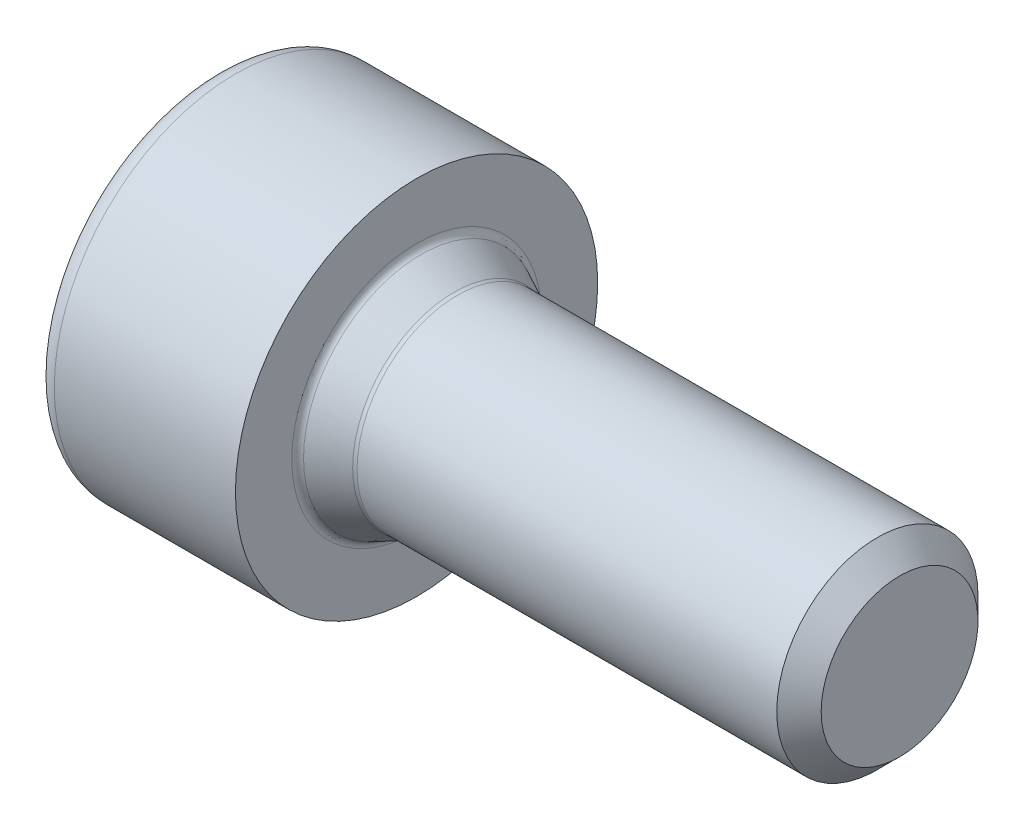
ISO-10303-21;
HEADER;
FILE_DESCRIPTION(('STEP AP214'),'2;1');
FILE_NAME('part.step','',(''),(''),'','','');
FILE_SCHEMA(('AUTOMOTIVE_DESIGN { 1 0 10303 214 1 1 1 1 }'));
ENDSEC;
DATA;
#1=APPLICATION_CONTEXT('core data for automotive mechanical design processes');
#2=APPLICATION_PROTOCOL_DEFINITION('international standard','automotive_design',2000,#1);
#3=PRODUCT_CONTEXT('',#1,'mechanical');
#4=PRODUCT('Part','Part','',(#3));
#5=PRODUCT_RELATED_PRODUCT_CATEGORY('part','',(#4));
#6=PRODUCT_DEFINITION_FORMATION('','',#4);
#7=PRODUCT_DEFINITION_CONTEXT('part definition',#1,'design');
#8=PRODUCT_DEFINITION('design','',#6,#7);
#9=PRODUCT_DEFINITION_SHAPE('','',#8);
#10=(LENGTH_UNIT() NAMED_UNIT(*) SI_UNIT(.MILLI.,.METRE.));
#11=(NAMED_UNIT(*) PLANE_ANGLE_UNIT() SI_UNIT($,.RADIAN.));
#12=(NAMED_UNIT(*) SI_UNIT($,.STERADIAN.) SOLID_ANGLE_UNIT());
#13=UNCERTAINTY_MEASURE_WITH_UNIT(LENGTH_MEASURE(1.E-05),#10,'distance_accuracy_value','');
#14=(GEOMETRIC_REPRESENTATION_CONTEXT(3) GLOBAL_UNCERTAINTY_ASSIGNED_CONTEXT((#13)) GLOBAL_UNIT_ASSIGNED_CONTEXT((#10,
#11,#12)) REPRESENTATION_CONTEXT('',''));
#15=CARTESIAN_POINT('',(0.,0.,0.));
#16=DIRECTION('',(0.,0.,1.));
#17=DIRECTION('',(1.,0.,0.));
#18=AXIS2_PLACEMENT_3D('',#15,#16,#17);
#19=CARTESIAN_POINT('',(-0.850000002960261,0.,0.));
#20=DIRECTION('',(-1.,0.,0.));
#21=DIRECTION('',(0.,0.,1.));
#22=AXIS2_PLACEMENT_3D('',#19,#20,#21);
#23=CONICAL_SURFACE('',#22,0.999999998290924,1.04719755119989);
#24=CARTESIAN_POINT('',(-0.272649734761821,0.,-1.11022302462516E-13));
#25=VERTEX_POINT('',#24);
#26=VERTEX_LOOP('',#25);
#27=FACE_BOUND('',#26,.T.);
#28=CARTESIAN_POINT('',(-0.850000002960261,0.,0.));
#29=DIRECTION('',(-1.,0.,0.));
#30=DIRECTION('',(0.,0.,1.));
#31=AXIS2_PLACEMENT_3D('',#28,#29,#30);
#32=CIRCLE('',#31,0.999999998290924);
#33=CARTESIAN_POINT('',(-0.85000000148013,0.866025403044387,-0.499999999572731));
#34=VERTEX_POINT('',#33);
#35=CARTESIAN_POINT('',(-0.85000000148013,0.,-0.999999999145462));
#36=VERTEX_POINT('',#35);
#37=EDGE_CURVE('E19',#34,#36,#32,.T.);
#38=ORIENTED_EDGE('',*,*,#37,.T.);
#39=CARTESIAN_POINT('',(-0.850000002960261,0.,0.));
#40=DIRECTION('',(-1.,0.,0.));
#41=DIRECTION('',(0.,0.,1.));
#42=AXIS2_PLACEMENT_3D('',#39,#40,#41);
#43=CIRCLE('',#42,0.999999998290924);
#44=CARTESIAN_POINT('',(-0.85000000148013,-0.866025403044386,-0.49999999957273));
#45=VERTEX_POINT('',#44);
#46=EDGE_CURVE('E90',#36,#45,#43,.T.);
#47=ORIENTED_EDGE('',*,*,#46,.T.);
#48=CARTESIAN_POINT('',(-0.850000002960261,0.,0.));
#49=DIRECTION('',(-1.,0.,0.));
#50=DIRECTION('',(0.,0.,1.));
#51=AXIS2_PLACEMENT_3D('',#48,#49,#50);
#52=CIRCLE('',#51,0.999999998290924);
#53=CARTESIAN_POINT('',(-0.85000000148013,-0.866025403044387,0.49999999957273));
#54=VERTEX_POINT('',#53);
#55=EDGE_CURVE('E104',#45,#54,#52,.T.);
#56=ORIENTED_EDGE('',*,*,#55,.T.);
#57=CARTESIAN_POINT('',(-0.850000002960261,0.,0.));
#58=DIRECTION('',(-1.,0.,0.));
#59=DIRECTION('',(0.,0.,1.));
#60=AXIS2_PLACEMENT_3D('',#57,#58,#59);
#61=CIRCLE('',#60,0.999999998290924);
#62=CARTESIAN_POINT('',(-0.85000000148013,0.,0.999999999145462));
#63=VERTEX_POINT('',#62);
#64=EDGE_CURVE('E163',#54,#63,#61,.T.);
#65=ORIENTED_EDGE('',*,*,#64,.T.);
#66=CARTESIAN_POINT('',(-0.850000002960261,0.,0.));
#67=DIRECTION('',(-1.,0.,0.));
#68=DIRECTION('',(0.,0.,1.));
#69=AXIS2_PLACEMENT_3D('',#66,#67,#68);
#70=CIRCLE('',#69,0.999999998290924);
#71=CARTESIAN_POINT('',(-0.85000000148013,0.866025403044386,0.49999999957273));
#72=VERTEX_POINT('',#71);
#73=EDGE_CURVE('E140',#63,#72,#70,.T.);
#74=ORIENTED_EDGE('',*,*,#73,.T.);
#75=CARTESIAN_POINT('',(-0.850000002960261,0.,0.));
#76=DIRECTION('',(-1.,0.,0.));
#77=DIRECTION('',(0.,0.,1.));
#78=AXIS2_PLACEMENT_3D('',#75,#76,#77);
#79=CIRCLE('',#78,0.999999998290924);
#80=EDGE_CURVE('E87',#72,#34,#79,.T.);
#81=ORIENTED_EDGE('',*,*,#80,.T.);
#82=EDGE_LOOP('',(#38,#47,#56,#65,#74,#81));
#83=FACE_BOUND('',#82,.T.);
#84=ADVANCED_FACE('F16',(#27,#83),#23,.F.);
#85=CARTESIAN_POINT('',(-0.85,0.,0.));
#86=DIRECTION('',(1.,0.,0.));
#87=DIRECTION('',(0.,0.,-1.));
#88=AXIS2_PLACEMENT_3D('',#85,#86,#87);
#89=PLANE('',#88);
#90=DIRECTION('',(0.,1.,0.));
#91=VECTOR('',#90,1.);
#92=CARTESIAN_POINT('',(-0.85,-0.577350269189626,-1.));
#93=LINE('',#92,#91);
#94=CARTESIAN_POINT('',(-0.85,0.577350269189626,-1.));
#95=VERTEX_POINT('',#94);
#96=EDGE_CURVE('E106',#95,#36,#93,.F.);
#97=ORIENTED_EDGE('',*,*,#96,.T.);
#98=ORIENTED_EDGE('',*,*,#37,.F.);
#99=DIRECTION('',(0.,0.5,0.866025403784439));
#100=VECTOR('',#99,1.);
#101=CARTESIAN_POINT('',(-0.849999999999999,0.577350269189626,-1.));
#102=LINE('',#101,#100);
#103=EDGE_CURVE('E109',#34,#95,#102,.F.);
#104=ORIENTED_EDGE('',*,*,#103,.T.);
#105=EDGE_LOOP('',(#97,#98,#104));
#106=FACE_BOUND('',#105,.T.);
#107=ADVANCED_FACE('F107',(#106),#89,.F.);
#108=CARTESIAN_POINT('',(-0.85,0.,0.));
#109=DIRECTION('',(1.,0.,0.));
#110=DIRECTION('',(0.,0.,-1.));
#111=AXIS2_PLACEMENT_3D('',#108,#109,#110);
#112=PLANE('',#111);
#113=DIRECTION('',(0.,0.5,-0.866025403784439));
#114=VECTOR('',#113,1.);
#115=CARTESIAN_POINT('',(-0.849999999999999,-1.15470053837925,0.));
#116=LINE('',#115,#114);
#117=CARTESIAN_POINT('',(-0.85,-0.577350269189625,-1.));
#118=VERTEX_POINT('',#117);
#119=EDGE_CURVE('E102',#118,#45,#116,.F.);
#120=ORIENTED_EDGE('',*,*,#119,.T.);
#121=ORIENTED_EDGE('',*,*,#46,.F.);
#122=DIRECTION('',(0.,1.,0.));
#123=VECTOR('',#122,1.);
#124=CARTESIAN_POINT('',(-0.850000000000002,-0.577350269189626,-1.));
#125=LINE('',#124,#123);
#126=EDGE_CURVE('E99',#36,#118,#125,.F.);
#127=ORIENTED_EDGE('',*,*,#126,.T.);
#128=EDGE_LOOP('',(#120,#121,#127));
#129=FACE_BOUND('',#128,.T.);
#130=ADVANCED_FACE('F97',(#129),#112,.F.);
#131=CARTESIAN_POINT('',(-0.85,0.,0.));
#132=DIRECTION('',(1.,0.,0.));
#133=DIRECTION('',(0.,0.,-1.));
#134=AXIS2_PLACEMENT_3D('',#131,#132,#133);
#135=PLANE('',#134);
#136=DIRECTION('',(0.,-0.5,-0.866025403784439));
#137=VECTOR('',#136,1.);
#138=CARTESIAN_POINT('',(-0.849999999999999,-0.577350269189626,1.));
#139=LINE('',#138,#137);
#140=CARTESIAN_POINT('',(-0.849999999999999,-1.15470053837925,0.));
#141=VERTEX_POINT('',#140);
#142=EDGE_CURVE('E179',#141,#54,#139,.F.);
#143=ORIENTED_EDGE('',*,*,#142,.T.);
#144=ORIENTED_EDGE('',*,*,#55,.F.);
#145=DIRECTION('',(0.,0.5,-0.866025403784439));
#146=VECTOR('',#145,1.);
#147=CARTESIAN_POINT('',(-0.849999999999999,-1.15470053837925,0.));
#148=LINE('',#147,#146);
#149=EDGE_CURVE('E113',#45,#141,#148,.F.);
#150=ORIENTED_EDGE('',*,*,#149,.T.);
#151=EDGE_LOOP('',(#143,#144,#150));
#152=FACE_BOUND('',#151,.T.);
#153=ADVANCED_FACE('F180',(#152),#135,.F.);
#154=CARTESIAN_POINT('',(-0.85,0.,0.));
#155=DIRECTION('',(1.,0.,0.));
#156=DIRECTION('',(0.,0.,-1.));
#157=AXIS2_PLACEMENT_3D('',#154,#155,#156);
#158=PLANE('',#157);
#159=DIRECTION('',(0.,1.,0.));
#160=VECTOR('',#159,1.);
#161=CARTESIAN_POINT('',(-0.85,0.577350269189626,1.));
#162=LINE('',#161,#160);
#163=CARTESIAN_POINT('',(-0.85,-0.577350269189626,1.));
#164=VERTEX_POINT('',#163);
#165=EDGE_CURVE('E176',#164,#63,#162,.T.);
#166=ORIENTED_EDGE('',*,*,#165,.T.);
#167=ORIENTED_EDGE('',*,*,#64,.F.);
#168=DIRECTION('',(0.,-0.5,-0.866025403784439));
#169=VECTOR('',#168,1.);
#170=CARTESIAN_POINT('',(-0.849999999999999,-0.577350269189626,1.));
#171=LINE('',#170,#169);
#172=EDGE_CURVE('E173',#54,#164,#171,.F.);
#173=ORIENTED_EDGE('',*,*,#172,.T.);
#174=EDGE_LOOP('',(#166,#167,#173));
#175=FACE_BOUND('',#174,.T.);
#176=ADVANCED_FACE('F171',(#175),#158,.F.);
#177=CARTESIAN_POINT('',(-0.85,0.,0.));
#178=DIRECTION('',(1.,0.,0.));
#179=DIRECTION('',(0.,0.,-1.));
#180=AXIS2_PLACEMENT_3D('',#177,#178,#179);
#181=PLANE('',#180);
#182=DIRECTION('',(0.,0.5,0.866025403784439));
#183=VECTOR('',#182,1.);
#184=CARTESIAN_POINT('',(-0.849999999999999,0.577350269189626,-1.));
#185=LINE('',#184,#183);
#186=CARTESIAN_POINT('',(-0.849999999999999,1.15470053837925,0.));
#187=VERTEX_POINT('',#186);
#188=EDGE_CURVE('E119',#187,#34,#185,.F.);
#189=ORIENTED_EDGE('',*,*,#188,.T.);
#190=ORIENTED_EDGE('',*,*,#80,.F.);
#191=DIRECTION('',(0.,-0.5,0.866025403784439));
#192=VECTOR('',#191,1.);
#193=CARTESIAN_POINT('',(-0.849999999999999,1.15470053837925,0.));
#194=LINE('',#193,#192);
#195=EDGE_CURVE('E242',#72,#187,#194,.F.);
#196=ORIENTED_EDGE('',*,*,#195,.T.);
#197=EDGE_LOOP('',(#189,#190,#196));
#198=FACE_BOUND('',#197,.T.);
#199=ADVANCED_FACE('F496',(#198),#181,.F.);
#200=CARTESIAN_POINT('',(-0.85,0.,0.));
#201=DIRECTION('',(1.,0.,0.));
#202=DIRECTION('',(0.,0.,-1.));
#203=AXIS2_PLACEMENT_3D('',#200,#201,#202);
#204=PLANE('',#203);
#205=DIRECTION('',(0.,-0.5,0.866025403784439));
#206=VECTOR('',#205,1.);
#207=CARTESIAN_POINT('',(-0.849999999999999,1.15470053837925,0.));
#208=LINE('',#207,#206);
#209=CARTESIAN_POINT('',(-0.849999999999999,0.577350269189625,1.));
#210=VERTEX_POINT('',#209);
#211=EDGE_CURVE('E144',#210,#72,#208,.F.);
#212=ORIENTED_EDGE('',*,*,#211,.T.);
#213=ORIENTED_EDGE('',*,*,#73,.F.);
#214=DIRECTION('',(0.,1.,0.));
#215=VECTOR('',#214,1.);
#216=CARTESIAN_POINT('',(-0.85,0.577350269189626,1.));
#217=LINE('',#216,#215);
#218=EDGE_CURVE('E184',#63,#210,#217,.T.);
#219=ORIENTED_EDGE('',*,*,#218,.T.);
#220=EDGE_LOOP('',(#212,#213,#219));
#221=FACE_BOUND('',#220,.T.);
#222=ADVANCED_FACE('F486',(#221),#204,.F.);
#223=CARTESIAN_POINT('',(-3.05,0.577350269189626,-1.));
#224=DIRECTION('',(0.,0.866025403784439,-0.5));
#225=DIRECTION('',(0.,0.5,0.866025403784439));
#226=AXIS2_PLACEMENT_3D('',#223,#224,#225);
#227=PLANE('',#226);
#228=DIRECTION('',(1.,0.,0.));
#229=VECTOR('',#228,1.);
#230=CARTESIAN_POINT('',(-3.05,1.15470053837925,0.));
#231=LINE('',#230,#229);
#232=CARTESIAN_POINT('',(-2.5,1.15470053837925,0.));
#233=VERTEX_POINT('',#232);
#234=EDGE_CURVE('E238',#187,#233,#231,.F.);
#235=ORIENTED_EDGE('',*,*,#234,.T.);
#236=DIRECTION('',(0.,-0.499999999999999,-0.866025403784439));
#237=VECTOR('',#236,1.);
#238=CARTESIAN_POINT('',(-2.5,1.15470053837925,0.));
#239=LINE('',#238,#237);
#240=CARTESIAN_POINT('',(-2.5,0.577350269189626,-1.));
#241=VERTEX_POINT('',#240);
#242=EDGE_CURVE('E132',#233,#241,#239,.T.);
#243=ORIENTED_EDGE('',*,*,#242,.T.);
#244=DIRECTION('',(-1.,0.,0.));
#245=VECTOR('',#244,1.);
#246=CARTESIAN_POINT('',(-3.05,0.577350269189626,-1.));
#247=LINE('',#246,#245);
#248=EDGE_CURVE('E114',#241,#95,#247,.F.);
#249=ORIENTED_EDGE('',*,*,#248,.T.);
#250=ORIENTED_EDGE('',*,*,#103,.F.);
#251=ORIENTED_EDGE('',*,*,#188,.F.);
#252=EDGE_LOOP('',(#235,#243,#249,#250,#251));
#253=FACE_BOUND('',#252,.T.);
#254=ADVANCED_FACE('F477',(#253),#227,.F.);
#255=CARTESIAN_POINT('',(-3.05,-0.577350269189626,-1.));
#256=DIRECTION('',(0.,0.,-1.));
#257=DIRECTION('',(-1.,0.,0.));
#258=AXIS2_PLACEMENT_3D('',#255,#256,#257);
#259=PLANE('',#258);
#260=ORIENTED_EDGE('',*,*,#248,.F.);
#261=DIRECTION('',(0.,1.,0.));
#262=VECTOR('',#261,1.);
#263=CARTESIAN_POINT('',(-2.5,1.,-1.));
#264=LINE('',#263,#262);
#265=CARTESIAN_POINT('',(-2.5,-0.577350269189625,-1.));
#266=VERTEX_POINT('',#265);
#267=EDGE_CURVE('E129',#241,#266,#264,.F.);
#268=ORIENTED_EDGE('',*,*,#267,.T.);
#269=DIRECTION('',(1.,0.,0.));
#270=VECTOR('',#269,1.);
#271=CARTESIAN_POINT('',(-3.05,-0.577350269189625,-1.));
#272=LINE('',#271,#270);
#273=EDGE_CURVE('E118',#266,#118,#272,.T.);
#274=ORIENTED_EDGE('',*,*,#273,.T.);
#275=ORIENTED_EDGE('',*,*,#126,.F.);
#276=ORIENTED_EDGE('',*,*,#96,.F.);
#277=EDGE_LOOP('',(#260,#268,#274,#275,#276));
#278=FACE_BOUND('',#277,.T.);
#279=ADVANCED_FACE('F116',(#278),#259,.F.);
#280=CARTESIAN_POINT('',(-3.05,-1.15470053837925,0.));
#281=DIRECTION('',(0.,-0.866025403784439,-0.5));
#282=DIRECTION('',(0.,0.5,-0.866025403784439));
#283=AXIS2_PLACEMENT_3D('',#280,#281,#282);
#284=PLANE('',#283);
#285=ORIENTED_EDGE('',*,*,#273,.F.);
#286=DIRECTION('',(0.,-0.499999999999999,0.866025403784439));
#287=VECTOR('',#286,1.);
#288=CARTESIAN_POINT('',(-2.5,-0.577350269189626,-1.));
#289=LINE('',#288,#287);
#290=CARTESIAN_POINT('',(-2.5,-1.15470053837925,0.));
#291=VERTEX_POINT('',#290);
#292=EDGE_CURVE('E131',#266,#291,#289,.T.);
#293=ORIENTED_EDGE('',*,*,#292,.T.);
#294=DIRECTION('',(1.,0.,0.));
#295=VECTOR('',#294,1.);
#296=CARTESIAN_POINT('',(-3.05,-1.15470053837925,0.));
#297=LINE('',#296,#295);
#298=EDGE_CURVE('E185',#291,#141,#297,.T.);
#299=ORIENTED_EDGE('',*,*,#298,.T.);
#300=ORIENTED_EDGE('',*,*,#149,.F.);
#301=ORIENTED_EDGE('',*,*,#119,.F.);
#302=EDGE_LOOP('',(#285,#293,#299,#300,#301));
#303=FACE_BOUND('',#302,.T.);
#304=ADVANCED_FACE('F215',(#303),#284,.F.);
#305=CARTESIAN_POINT('',(-3.05,-0.577350269189626,1.));
#306=DIRECTION('',(0.,-0.866025403784439,0.5));
#307=DIRECTION('',(0.,-0.5,-0.866025403784439));
#308=AXIS2_PLACEMENT_3D('',#305,#306,#307);
#309=PLANE('',#308);
#310=ORIENTED_EDGE('',*,*,#298,.F.);
#311=DIRECTION('',(0.,0.499999999999999,0.866025403784439));
#312=VECTOR('',#311,1.);
#313=CARTESIAN_POINT('',(-2.5,-1.15470053837925,0.));
#314=LINE('',#313,#312);
#315=CARTESIAN_POINT('',(-2.5,-0.577350269189626,1.));
#316=VERTEX_POINT('',#315);
#317=EDGE_CURVE('E198',#291,#316,#314,.T.);
#318=ORIENTED_EDGE('',*,*,#317,.T.);
#319=DIRECTION('',(1.,0.,0.));
#320=VECTOR('',#319,1.);
#321=CARTESIAN_POINT('',(-3.05,-0.577350269189626,1.));
#322=LINE('',#321,#320);
#323=EDGE_CURVE('E188',#316,#164,#322,.T.);
#324=ORIENTED_EDGE('',*,*,#323,.T.);
#325=ORIENTED_EDGE('',*,*,#172,.F.);
#326=ORIENTED_EDGE('',*,*,#142,.F.);
#327=EDGE_LOOP('',(#310,#318,#324,#325,#326));
#328=FACE_BOUND('',#327,.T.);
#329=ADVANCED_FACE('F187',(#328),#309,.F.);
#330=CARTESIAN_POINT('',(-3.05,0.577350269189626,1.));
#331=DIRECTION('',(0.,0.,1.));
#332=DIRECTION('',(1.,0.,0.));
#333=AXIS2_PLACEMENT_3D('',#330,#331,#332);
#334=PLANE('',#333);
#335=ORIENTED_EDGE('',*,*,#323,.F.);
#336=DIRECTION('',(0.,1.,0.));
#337=VECTOR('',#336,1.);
#338=CARTESIAN_POINT('',(-2.5,1.,1.));
#339=LINE('',#338,#337);
#340=CARTESIAN_POINT('',(-2.5,0.577350269189625,1.));
#341=VERTEX_POINT('',#340);
#342=EDGE_CURVE('E34',#316,#341,#339,.T.);
#343=ORIENTED_EDGE('',*,*,#342,.T.);
#344=DIRECTION('',(1.,0.,0.));
#345=VECTOR('',#344,1.);
#346=CARTESIAN_POINT('',(-3.05,0.577350269189625,1.));
#347=LINE('',#346,#345);
#348=EDGE_CURVE('E241',#341,#210,#347,.T.);
#349=ORIENTED_EDGE('',*,*,#348,.T.);
#350=ORIENTED_EDGE('',*,*,#218,.F.);
#351=ORIENTED_EDGE('',*,*,#165,.F.);
#352=EDGE_LOOP('',(#335,#343,#349,#350,#351));
#353=FACE_BOUND('',#352,.T.);
#354=ADVANCED_FACE('F444',(#353),#334,.F.);
#355=CARTESIAN_POINT('',(-3.05,1.15470053837925,0.));
#356=DIRECTION('',(0.,0.866025403784439,0.5));
#357=DIRECTION('',(0.,-0.5,0.866025403784439));
#358=AXIS2_PLACEMENT_3D('',#355,#356,#357);
#359=PLANE('',#358);
#360=ORIENTED_EDGE('',*,*,#348,.F.);
#361=DIRECTION('',(0.,0.499999999999999,-0.866025403784439));
#362=VECTOR('',#361,1.);
#363=CARTESIAN_POINT('',(-2.5,0.577350269189626,1.));
#364=LINE('',#363,#362);
#365=EDGE_CURVE('E224',#341,#233,#364,.T.);
#366=ORIENTED_EDGE('',*,*,#365,.T.);
#367=ORIENTED_EDGE('',*,*,#234,.F.);
#368=ORIENTED_EDGE('',*,*,#195,.F.);
#369=ORIENTED_EDGE('',*,*,#211,.F.);
#370=EDGE_LOOP('',(#360,#366,#367,#368,#369));
#371=FACE_BOUND('',#370,.T.);
#372=ADVANCED_FACE('F436',(#371),#359,.F.);
#373=CARTESIAN_POINT('',(-2.5,1.,0.));
#374=DIRECTION('',(1.,0.,0.));
#375=DIRECTION('',(0.,0.,-1.));
#376=AXIS2_PLACEMENT_3D('',#373,#374,#375);
#377=PLANE('',#376);
#378=ORIENTED_EDGE('',*,*,#342,.F.);
#379=ORIENTED_EDGE('',*,*,#317,.F.);
#380=ORIENTED_EDGE('',*,*,#292,.F.);
#381=ORIENTED_EDGE('',*,*,#267,.F.);
#382=ORIENTED_EDGE('',*,*,#242,.F.);
#383=ORIENTED_EDGE('',*,*,#365,.F.);
#384=EDGE_LOOP('',(#378,#379,#380,#381,#382,#383));
#385=FACE_BOUND('',#384,.T.);
#386=CARTESIAN_POINT('',(-2.5,0.,0.));
#387=DIRECTION('',(1.,0.,0.));
#388=DIRECTION('',(0.,0.,-1.));
#389=AXIS2_PLACEMENT_3D('',#386,#387,#388);
#390=CIRCLE('',#389,2.);
#391=CARTESIAN_POINT('',(-2.5,0.,-2.));
#392=VERTEX_POINT('',#391);
#393=EDGE_CURVE('E226',#392,#392,#390,.T.);
#394=ORIENTED_EDGE('',*,*,#393,.F.);
#395=EDGE_LOOP('',(#394));
#396=FACE_BOUND('',#395,.T.);
#397=ADVANCED_FACE('F219',(#385,#396),#377,.F.);
#398=CARTESIAN_POINT('',(-2.25,0.,0.));
#399=DIRECTION('',(1.,0.,0.));
#400=DIRECTION('',(0.,0.,-1.));
#401=AXIS2_PLACEMENT_3D('',#398,#399,#400);
#402=TOROIDAL_SURFACE('',#401,2.,0.25);
#403=CARTESIAN_POINT('',(-2.25,0.,0.));
#404=DIRECTION('',(-1.,0.,0.));
#405=DIRECTION('',(0.,0.,1.));
#406=AXIS2_PLACEMENT_3D('',#403,#404,#405);
#407=CIRCLE('',#406,2.25);
#408=CARTESIAN_POINT('',(-2.25,0.,2.25));
#409=VERTEX_POINT('',#408);
#410=EDGE_CURVE('E158',#409,#409,#407,.F.);
#411=ORIENTED_EDGE('',*,*,#410,.F.);
#412=EDGE_LOOP('',(#411));
#413=FACE_BOUND('',#412,.T.);
#414=ORIENTED_EDGE('',*,*,#393,.T.);
#415=EDGE_LOOP('',(#414));
#416=FACE_BOUND('',#415,.T.);
#417=ADVANCED_FACE('F265',(#413,#416),#402,.T.);
#418=CARTESIAN_POINT('',(6.,0.,0.));
#419=DIRECTION('',(-1.,0.,0.));
#420=DIRECTION('',(0.,0.,1.));
#421=AXIS2_PLACEMENT_3D('',#418,#419,#420);
#422=CYLINDRICAL_SURFACE('',#421,2.25);
#423=ORIENTED_EDGE('',*,*,#410,.T.);
#424=EDGE_LOOP('',(#423));
#425=FACE_BOUND('',#424,.T.);
#426=CARTESIAN_POINT('',(0.,0.,0.));
#427=DIRECTION('',(-1.,0.,0.));
#428=DIRECTION('',(0.,0.,1.));
#429=AXIS2_PLACEMENT_3D('',#426,#427,#428);
#430=CIRCLE('',#429,2.25);
#431=CARTESIAN_POINT('',(0.,0.,2.25));
#432=VERTEX_POINT('',#431);
#433=EDGE_CURVE('E154',#432,#432,#430,.T.);
#434=ORIENTED_EDGE('',*,*,#433,.T.);
#435=EDGE_LOOP('',(#434));
#436=FACE_BOUND('',#435,.T.);
#437=ADVANCED_FACE('F276',(#425,#436),#422,.T.);
#438=CARTESIAN_POINT('',(0.,2.25,0.));
#439=DIRECTION('',(-1.,0.,0.));
#440=DIRECTION('',(0.,0.,1.));
#441=AXIS2_PLACEMENT_3D('',#438,#439,#440);
#442=PLANE('',#441);
#443=ORIENTED_EDGE('',*,*,#433,.F.);
#444=EDGE_LOOP('',(#443));
#445=FACE_BOUND('',#444,.T.);
#446=CARTESIAN_POINT('',(0.,0.,0.));
#447=DIRECTION('',(1.,0.,0.));
#448=DIRECTION('',(0.,0.,-1.));
#449=AXIS2_PLACEMENT_3D('',#446,#447,#448);
#450=CIRCLE('',#449,1.55);
#451=CARTESIAN_POINT('',(0.,0.,-1.55));
#452=VERTEX_POINT('',#451);
#453=EDGE_CURVE('E157',#452,#452,#450,.F.);
#454=ORIENTED_EDGE('',*,*,#453,.T.);
#455=EDGE_LOOP('',(#454));
#456=FACE_BOUND('',#455,.T.);
#457=ADVANCED_FACE('F316',(#445,#456),#442,.F.);
#458=CARTESIAN_POINT('',(0.100000000000001,0.,0.));
#459=DIRECTION('',(1.,0.,0.));
#460=DIRECTION('',(0.,0.,-1.));
#461=AXIS2_PLACEMENT_3D('',#458,#459,#460);
#462=TOROIDAL_SURFACE('',#461,1.55,0.1);
#463=ORIENTED_EDGE('',*,*,#453,.F.);
#464=EDGE_LOOP('',(#463));
#465=FACE_BOUND('',#464,.T.);
#466=CARTESIAN_POINT('',(0.0561576367772432,0.,0.));
#467=DIRECTION('',(-1.,0.,0.));
#468=DIRECTION('',(0.,0.,1.));
#469=AXIS2_PLACEMENT_3D('',#466,#467,#468);
#470=CIRCLE('',#469,1.46012315539679);
#471=CARTESIAN_POINT('',(0.0561576367772432,0.,1.46012315539679));
#472=VERTEX_POINT('',#471);
#473=EDGE_CURVE('E151',#472,#472,#470,.F.);
#474=ORIENTED_EDGE('',*,*,#473,.F.);
#475=EDGE_LOOP('',(#474));
#476=FACE_BOUND('',#475,.T.);
#477=ADVANCED_FACE('F305',(#465,#476),#462,.F.);
#478=CARTESIAN_POINT('',(6.,0.974,0.));
#479=DIRECTION('',(-1.,0.,0.));
#480=DIRECTION('',(0.,0.,1.));
#481=AXIS2_PLACEMENT_3D('',#478,#479,#480);
#482=PLANE('',#481);
#483=CARTESIAN_POINT('',(6.00000000002865,0.,0.));
#484=DIRECTION('',(-1.,0.,0.));
#485=DIRECTION('',(0.,0.,1.));
#486=AXIS2_PLACEMENT_3D('',#483,#484,#485);
#487=CIRCLE('',#486,0.973999999985153);
#488=CARTESIAN_POINT('',(6.00000000002865,0.,0.973999999985153));
#489=VERTEX_POINT('',#488);
#490=EDGE_CURVE('E147',#489,#489,#487,.T.);
#491=ORIENTED_EDGE('',*,*,#490,.F.);
#492=EDGE_LOOP('',(#491));
#493=FACE_BOUND('',#492,.T.);
#494=ADVANCED_FACE('F315',(#493),#482,.F.);
#495=CARTESIAN_POINT('',(0.05615763689093,0.,0.));
#496=DIRECTION('',(-1.,0.,0.));
#497=DIRECTION('',(0.,0.,1.));
#498=AXIS2_PLACEMENT_3D('',#495,#496,#497);
#499=CONICAL_SURFACE('',#498,1.46012315533994,0.453844001546094);
#500=ORIENTED_EDGE('',*,*,#473,.T.);
#501=EDGE_LOOP('',(#500));
#502=FACE_BOUND('',#501,.T.);
#503=CARTESIAN_POINT('',(0.466157636797859,0.,0.));
#504=DIRECTION('',(1.,0.,0.));
#505=DIRECTION('',(0.,0.,-1.));
#506=AXIS2_PLACEMENT_3D('',#503,#504,#505);
#507=CIRCLE('',#506,1.26012315543561);
#508=CARTESIAN_POINT('',(0.466157636797859,0.,-1.26012315543561));
#509=VERTEX_POINT('',#508);
#510=EDGE_CURVE('E150',#509,#509,#507,.F.);
#511=ORIENTED_EDGE('',*,*,#510,.T.);
#512=EDGE_LOOP('',(#511));
#513=FACE_BOUND('',#512,.T.);
#514=ADVANCED_FACE('F355',(#502,#513),#499,.T.);
#515=CARTESIAN_POINT('',(5.72400000004336,0.,0.));
#516=DIRECTION('',(-1.,0.,0.));
#517=DIRECTION('',(0.,0.,1.));
#518=AXIS2_PLACEMENT_3D('',#515,#516,#517);
#519=CONICAL_SURFACE('',#518,1.24999999997044,0.785398163397448);
#520=CARTESIAN_POINT('',(5.724,0.,0.));
#521=DIRECTION('',(-1.,0.,0.));
#522=DIRECTION('',(0.,0.,1.));
#523=AXIS2_PLACEMENT_3D('',#520,#521,#522);
#524=CIRCLE('',#523,1.25);
#525=CARTESIAN_POINT('',(5.724,0.,1.25));
#526=VERTEX_POINT('',#525);
#527=EDGE_CURVE('E25',#526,#526,#524,.T.);
#528=ORIENTED_EDGE('',*,*,#527,.F.);
#529=EDGE_LOOP('',(#528));
#530=FACE_BOUND('',#529,.T.);
#531=ORIENTED_EDGE('',*,*,#490,.T.);
#532=EDGE_LOOP('',(#531));
#533=FACE_BOUND('',#532,.T.);
#534=ADVANCED_FACE('F352',(#530,#533),#519,.T.);
#535=CARTESIAN_POINT('',(0.510000000000002,0.,0.));
#536=DIRECTION('',(1.,0.,0.));
#537=DIRECTION('',(0.,0.,-1.));
#538=AXIS2_PLACEMENT_3D('',#535,#536,#537);
#539=TOROIDAL_SURFACE('',#538,1.35,0.1);
#540=ORIENTED_EDGE('',*,*,#510,.F.);
#541=EDGE_LOOP('',(#540));
#542=FACE_BOUND('',#541,.T.);
#543=CARTESIAN_POINT('',(0.51,0.,0.));
#544=DIRECTION('',(-1.,0.,0.));
#545=DIRECTION('',(0.,0.,1.));
#546=AXIS2_PLACEMENT_3D('',#543,#544,#545);
#547=CIRCLE('',#546,1.25);
#548=CARTESIAN_POINT('',(0.51,0.,1.25));
#549=VERTEX_POINT('',#548);
#550=EDGE_CURVE('E10',#549,#549,#547,.F.);
#551=ORIENTED_EDGE('',*,*,#550,.F.);
#552=EDGE_LOOP('',(#551));
#553=FACE_BOUND('',#552,.T.);
#554=ADVANCED_FACE('F347',(#542,#553),#539,.F.);
#555=CARTESIAN_POINT('',(6.,0.,0.));
#556=DIRECTION('',(-1.,0.,0.));
#557=DIRECTION('',(0.,0.,1.));
#558=AXIS2_PLACEMENT_3D('',#555,#556,#557);
#559=CYLINDRICAL_SURFACE('',#558,1.25);
#560=ORIENTED_EDGE('',*,*,#550,.T.);
#561=EDGE_LOOP('',(#560));
#562=FACE_BOUND('',#561,.T.);
#563=ORIENTED_EDGE('',*,*,#527,.T.);
#564=EDGE_LOOP('',(#563));
#565=FACE_BOUND('',#564,.T.);
#566=ADVANCED_FACE('F351',(#562,#565),#559,.T.);
#567=CLOSED_SHELL('',(#84,#107,#130,#153,#176,#199,#222,#254,#279,#304,#329,#354,#372,#397,#417,
#437,#457,#477,#494,#514,#534,#554,#566));
#568=MANIFOLD_SOLID_BREP('B1',#567);
#569=ADVANCED_BREP_SHAPE_REPRESENTATION('',(#18,#568),#14);
#570=SHAPE_DEFINITION_REPRESENTATION(#9,#569);
ENDSEC;
END-ISO-10303-21;
